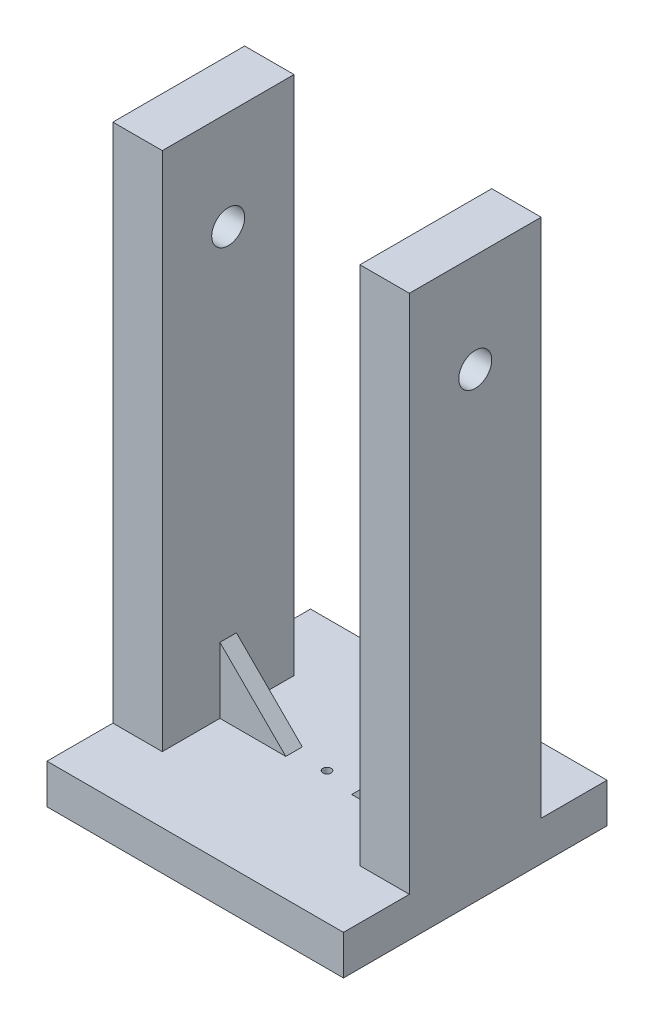
ISO-10303-21;
HEADER;
FILE_DESCRIPTION(('STEP AP214'),'2;1');
FILE_NAME('part.step','',(''),(''),'','','');
FILE_SCHEMA(('AUTOMOTIVE_DESIGN { 1 0 10303 214 1 1 1 1 }'));
ENDSEC;
DATA;
#1=APPLICATION_CONTEXT('core data for automotive mechanical design processes');
#2=APPLICATION_PROTOCOL_DEFINITION('international standard','automotive_design',2000,#1);
#3=PRODUCT_CONTEXT('',#1,'mechanical');
#4=PRODUCT('Part','Part','',(#3));
#5=PRODUCT_RELATED_PRODUCT_CATEGORY('part','',(#4));
#6=PRODUCT_DEFINITION_FORMATION('','',#4);
#7=PRODUCT_DEFINITION_CONTEXT('part definition',#1,'design');
#8=PRODUCT_DEFINITION('design','',#6,#7);
#9=PRODUCT_DEFINITION_SHAPE('','',#8);
#10=(LENGTH_UNIT() NAMED_UNIT(*) SI_UNIT(.MILLI.,.METRE.));
#11=(NAMED_UNIT(*) PLANE_ANGLE_UNIT() SI_UNIT($,.RADIAN.));
#12=(NAMED_UNIT(*) SI_UNIT($,.STERADIAN.) SOLID_ANGLE_UNIT());
#13=UNCERTAINTY_MEASURE_WITH_UNIT(LENGTH_MEASURE(1.E-05),#10,'distance_accuracy_value','');
#14=(GEOMETRIC_REPRESENTATION_CONTEXT(3) GLOBAL_UNCERTAINTY_ASSIGNED_CONTEXT((#13)) GLOBAL_UNIT_ASSIGNED_CONTEXT((#10,
#11,#12)) REPRESENTATION_CONTEXT('',''));
#15=CARTESIAN_POINT('',(0.,0.,0.));
#16=DIRECTION('',(0.,0.,1.));
#17=DIRECTION('',(1.,0.,0.));
#18=AXIS2_PLACEMENT_3D('',#15,#16,#17);
#19=CARTESIAN_POINT('',(0.,12.,0.));
#20=DIRECTION('',(0.,1.,0.));
#21=DIRECTION('',(0.,0.,1.));
#22=AXIS2_PLACEMENT_3D('',#19,#20,#21);
#23=PLANE('',#22);
#24=DIRECTION('',(1.,0.,0.));
#25=VECTOR('',#24,1.);
#26=CARTESIAN_POINT('',(0.,12.,2.5));
#27=LINE('',#26,#25);
#28=CARTESIAN_POINT('',(10.,12.,2.5));
#29=VERTEX_POINT('',#28);
#30=CARTESIAN_POINT('',(30.,12.,2.5));
#31=VERTEX_POINT('',#30);
#32=EDGE_CURVE('E59',#29,#31,#27,.T.);
#33=ORIENTED_EDGE('',*,*,#32,.F.);
#34=DIRECTION('',(0.,0.,1.));
#35=VECTOR('',#34,1.);
#36=CARTESIAN_POINT('',(10.,12.,0.));
#37=LINE('',#36,#35);
#38=CARTESIAN_POINT('',(10.,12.,-2.5));
#39=VERTEX_POINT('',#38);
#40=EDGE_CURVE('E63',#39,#29,#37,.T.);
#41=ORIENTED_EDGE('',*,*,#40,.F.);
#42=DIRECTION('',(1.,0.,0.));
#43=VECTOR('',#42,1.);
#44=CARTESIAN_POINT('',(0.,12.,-2.5));
#45=LINE('',#44,#43);
#46=CARTESIAN_POINT('',(30.,12.,-2.5));
#47=VERTEX_POINT('',#46);
#48=EDGE_CURVE('E180',#39,#47,#45,.T.);
#49=ORIENTED_EDGE('',*,*,#48,.T.);
#50=DIRECTION('',(0.,0.,1.));
#51=VECTOR('',#50,1.);
#52=CARTESIAN_POINT('',(30.,12.,20.));
#53=LINE('',#52,#51);
#54=CARTESIAN_POINT('',(30.,12.,-20.));
#55=VERTEX_POINT('',#54);
#56=EDGE_CURVE('E168',#55,#47,#53,.T.);
#57=ORIENTED_EDGE('',*,*,#56,.F.);
#58=DIRECTION('',(-1.,0.,0.));
#59=VECTOR('',#58,1.);
#60=CARTESIAN_POINT('',(30.,12.,-20.));
#61=LINE('',#60,#59);
#62=CARTESIAN_POINT('',(45.,12.,-20.));
#63=VERTEX_POINT('',#62);
#64=EDGE_CURVE('E177',#63,#55,#61,.T.);
#65=ORIENTED_EDGE('',*,*,#64,.F.);
#66=DIRECTION('',(0.,0.,-1.));
#67=VECTOR('',#66,1.);
#68=CARTESIAN_POINT('',(45.,12.,-40.));
#69=LINE('',#68,#67);
#70=CARTESIAN_POINT('',(45.,12.,-40.));
#71=VERTEX_POINT('',#70);
#72=EDGE_CURVE('E230',#63,#71,#69,.T.);
#73=ORIENTED_EDGE('',*,*,#72,.T.);
#74=DIRECTION('',(-1.,0.,0.));
#75=VECTOR('',#74,1.);
#76=CARTESIAN_POINT('',(-45.,12.,-40.));
#77=LINE('',#76,#75);
#78=CARTESIAN_POINT('',(-45.,12.,-40.));
#79=VERTEX_POINT('',#78);
#80=EDGE_CURVE('E247',#71,#79,#77,.T.);
#81=ORIENTED_EDGE('',*,*,#80,.T.);
#82=DIRECTION('',(0.,0.,1.));
#83=VECTOR('',#82,1.);
#84=CARTESIAN_POINT('',(-45.,12.,-40.));
#85=LINE('',#84,#83);
#86=CARTESIAN_POINT('',(-45.,12.,-20.));
#87=VERTEX_POINT('',#86);
#88=EDGE_CURVE('E243',#79,#87,#85,.T.);
#89=ORIENTED_EDGE('',*,*,#88,.T.);
#90=DIRECTION('',(-1.,0.,0.));
#91=VECTOR('',#90,1.);
#92=CARTESIAN_POINT('',(-45.,12.,-20.));
#93=LINE('',#92,#91);
#94=CARTESIAN_POINT('',(-30.,12.,-20.));
#95=VERTEX_POINT('',#94);
#96=EDGE_CURVE('E275',#95,#87,#93,.T.);
#97=ORIENTED_EDGE('',*,*,#96,.F.);
#98=DIRECTION('',(0.,0.,-1.));
#99=VECTOR('',#98,1.);
#100=CARTESIAN_POINT('',(-30.,12.,20.));
#101=LINE('',#100,#99);
#102=CARTESIAN_POINT('',(-30.,12.,-2.5));
#103=VERTEX_POINT('',#102);
#104=EDGE_CURVE('E283',#103,#95,#101,.T.);
#105=ORIENTED_EDGE('',*,*,#104,.F.);
#106=DIRECTION('',(1.,0.,0.));
#107=VECTOR('',#106,1.);
#108=CARTESIAN_POINT('',(0.,12.,-2.5));
#109=LINE('',#108,#107);
#110=CARTESIAN_POINT('',(-10.,12.,-2.5));
#111=VERTEX_POINT('',#110);
#112=EDGE_CURVE('E342',#103,#111,#109,.T.);
#113=ORIENTED_EDGE('',*,*,#112,.T.);
#114=DIRECTION('',(0.,0.,1.));
#115=VECTOR('',#114,1.);
#116=CARTESIAN_POINT('',(-10.,12.,0.));
#117=LINE('',#116,#115);
#118=CARTESIAN_POINT('',(-10.,12.,2.5));
#119=VERTEX_POINT('',#118);
#120=EDGE_CURVE('E345',#119,#111,#117,.F.);
#121=ORIENTED_EDGE('',*,*,#120,.F.);
#122=DIRECTION('',(1.,0.,0.));
#123=VECTOR('',#122,1.);
#124=CARTESIAN_POINT('',(0.,12.,2.5));
#125=LINE('',#124,#123);
#126=CARTESIAN_POINT('',(-30.,12.,2.5));
#127=VERTEX_POINT('',#126);
#128=EDGE_CURVE('E338',#127,#119,#125,.T.);
#129=ORIENTED_EDGE('',*,*,#128,.F.);
#130=CARTESIAN_POINT('',(-30.,12.,20.));
#131=VERTEX_POINT('',#130);
#132=EDGE_CURVE('E279',#131,#127,#101,.T.);
#133=ORIENTED_EDGE('',*,*,#132,.F.);
#134=DIRECTION('',(1.,0.,0.));
#135=VECTOR('',#134,1.);
#136=CARTESIAN_POINT('',(-45.,12.,20.));
#137=LINE('',#136,#135);
#138=CARTESIAN_POINT('',(-45.,12.,20.));
#139=VERTEX_POINT('',#138);
#140=EDGE_CURVE('E270',#139,#131,#137,.T.);
#141=ORIENTED_EDGE('',*,*,#140,.F.);
#142=CARTESIAN_POINT('',(-45.,12.,40.));
#143=VERTEX_POINT('',#142);
#144=EDGE_CURVE('E246',#139,#143,#85,.T.);
#145=ORIENTED_EDGE('',*,*,#144,.T.);
#146=DIRECTION('',(1.,0.,0.));
#147=VECTOR('',#146,1.);
#148=CARTESIAN_POINT('',(-45.,12.,40.));
#149=LINE('',#148,#147);
#150=CARTESIAN_POINT('',(45.,12.,40.));
#151=VERTEX_POINT('',#150);
#152=EDGE_CURVE('E226',#143,#151,#149,.T.);
#153=ORIENTED_EDGE('',*,*,#152,.T.);
#154=CARTESIAN_POINT('',(45.,12.,20.));
#155=VERTEX_POINT('',#154);
#156=EDGE_CURVE('E250',#151,#155,#69,.T.);
#157=ORIENTED_EDGE('',*,*,#156,.T.);
#158=DIRECTION('',(1.,0.,0.));
#159=VECTOR('',#158,1.);
#160=CARTESIAN_POINT('',(30.,12.,20.));
#161=LINE('',#160,#159);
#162=CARTESIAN_POINT('',(30.,12.,20.));
#163=VERTEX_POINT('',#162);
#164=EDGE_CURVE('E299',#163,#155,#161,.T.);
#165=ORIENTED_EDGE('',*,*,#164,.F.);
#166=EDGE_CURVE('E178',#31,#163,#53,.T.);
#167=ORIENTED_EDGE('',*,*,#166,.F.);
#168=EDGE_LOOP('',(#33,#41,#49,#57,#65,#73,#81,#89,#97,#105,#113,#121,#129,#133,#141,#145,#153,
#157,#165,#167));
#169=FACE_BOUND('',#168,.T.);
#170=CARTESIAN_POINT('',(0.,12.,0.));
#171=DIRECTION('',(0.,1.,0.));
#172=DIRECTION('',(0.,0.,1.));
#173=AXIS2_PLACEMENT_3D('',#170,#171,#172);
#174=CIRCLE('',#173,1.25);
#175=CARTESIAN_POINT('',(0.,12.,1.25));
#176=VERTEX_POINT('',#175);
#177=EDGE_CURVE('E199',#176,#176,#174,.F.);
#178=ORIENTED_EDGE('',*,*,#177,.T.);
#179=EDGE_LOOP('',(#178));
#180=FACE_BOUND('',#179,.T.);
#181=ADVANCED_FACE('F43',(#169,#180),#23,.T.);
#182=CARTESIAN_POINT('',(45.,12.,-40.));
#183=DIRECTION('',(-1.,0.,0.));
#184=DIRECTION('',(0.,0.,1.));
#185=AXIS2_PLACEMENT_3D('',#182,#183,#184);
#186=PLANE('',#185);
#187=CARTESIAN_POINT('',(45.,140.,0.));
#188=DIRECTION('',(1.,0.,0.));
#189=DIRECTION('',(0.,0.,-1.));
#190=AXIS2_PLACEMENT_3D('',#187,#188,#189);
#191=CIRCLE('',#190,5.);
#192=CARTESIAN_POINT('',(45.,140.,-5.));
#193=VERTEX_POINT('',#192);
#194=EDGE_CURVE('E203',#193,#193,#191,.T.);
#195=ORIENTED_EDGE('',*,*,#194,.F.);
#196=EDGE_LOOP('',(#195));
#197=FACE_BOUND('',#196,.T.);
#198=DIRECTION('',(0.,0.,-1.));
#199=VECTOR('',#198,1.);
#200=CARTESIAN_POINT('',(45.,0.,-40.));
#201=LINE('',#200,#199);
#202=CARTESIAN_POINT('',(45.,0.,40.));
#203=VERTEX_POINT('',#202);
#204=CARTESIAN_POINT('',(45.,0.,-40.));
#205=VERTEX_POINT('',#204);
#206=EDGE_CURVE('E237',#203,#205,#201,.T.);
#207=ORIENTED_EDGE('',*,*,#206,.T.);
#208=DIRECTION('',(0.,-1.,0.));
#209=VECTOR('',#208,1.);
#210=CARTESIAN_POINT('',(45.,12.,-40.));
#211=LINE('',#210,#209);
#212=EDGE_CURVE('E198',#71,#205,#211,.T.);
#213=ORIENTED_EDGE('',*,*,#212,.F.);
#214=ORIENTED_EDGE('',*,*,#72,.F.);
#215=DIRECTION('',(0.,-1.,0.));
#216=VECTOR('',#215,1.);
#217=CARTESIAN_POINT('',(45.,170.,-20.));
#218=LINE('',#217,#216);
#219=CARTESIAN_POINT('',(45.,170.,-20.));
#220=VERTEX_POINT('',#219);
#221=EDGE_CURVE('E323',#220,#63,#218,.T.);
#222=ORIENTED_EDGE('',*,*,#221,.F.);
#223=DIRECTION('',(0.,0.,-1.));
#224=VECTOR('',#223,1.);
#225=CARTESIAN_POINT('',(45.,170.,20.));
#226=LINE('',#225,#224);
#227=CARTESIAN_POINT('',(45.,170.,20.));
#228=VERTEX_POINT('',#227);
#229=EDGE_CURVE('E295',#228,#220,#226,.T.);
#230=ORIENTED_EDGE('',*,*,#229,.F.);
#231=DIRECTION('',(0.,-1.,0.));
#232=VECTOR('',#231,1.);
#233=CARTESIAN_POINT('',(45.,170.,20.));
#234=LINE('',#233,#232);
#235=EDGE_CURVE('E309',#228,#155,#234,.T.);
#236=ORIENTED_EDGE('',*,*,#235,.T.);
#237=ORIENTED_EDGE('',*,*,#156,.F.);
#238=DIRECTION('',(0.,-1.,0.));
#239=VECTOR('',#238,1.);
#240=CARTESIAN_POINT('',(45.,12.,40.));
#241=LINE('',#240,#239);
#242=EDGE_CURVE('E222',#151,#203,#241,.T.);
#243=ORIENTED_EDGE('',*,*,#242,.T.);
#244=EDGE_LOOP('',(#207,#213,#214,#222,#230,#236,#237,#243));
#245=FACE_BOUND('',#244,.T.);
#246=ADVANCED_FACE('F45',(#197,#245),#186,.F.);
#247=CARTESIAN_POINT('',(-45.,12.,-40.));
#248=DIRECTION('',(0.,0.,1.));
#249=DIRECTION('',(1.,0.,0.));
#250=AXIS2_PLACEMENT_3D('',#247,#248,#249);
#251=PLANE('',#250);
#252=DIRECTION('',(-1.,0.,0.));
#253=VECTOR('',#252,1.);
#254=CARTESIAN_POINT('',(-45.,0.,-40.));
#255=LINE('',#254,#253);
#256=CARTESIAN_POINT('',(-45.,0.,-40.));
#257=VERTEX_POINT('',#256);
#258=EDGE_CURVE('E234',#205,#257,#255,.T.);
#259=ORIENTED_EDGE('',*,*,#258,.T.);
#260=DIRECTION('',(0.,-1.,0.));
#261=VECTOR('',#260,1.);
#262=CARTESIAN_POINT('',(-45.,12.,-40.));
#263=LINE('',#262,#261);
#264=EDGE_CURVE('E214',#79,#257,#263,.T.);
#265=ORIENTED_EDGE('',*,*,#264,.F.);
#266=ORIENTED_EDGE('',*,*,#80,.F.);
#267=ORIENTED_EDGE('',*,*,#212,.T.);
#268=EDGE_LOOP('',(#259,#265,#266,#267));
#269=FACE_BOUND('',#268,.T.);
#270=ADVANCED_FACE('F414',(#269),#251,.F.);
#271=CARTESIAN_POINT('',(-45.,12.,-40.));
#272=DIRECTION('',(1.,0.,0.));
#273=DIRECTION('',(0.,0.,-1.));
#274=AXIS2_PLACEMENT_3D('',#271,#272,#273);
#275=PLANE('',#274);
#276=DIRECTION('',(0.,0.,1.));
#277=VECTOR('',#276,1.);
#278=CARTESIAN_POINT('',(-45.,0.,-40.));
#279=LINE('',#278,#277);
#280=CARTESIAN_POINT('',(-45.,0.,40.));
#281=VERTEX_POINT('',#280);
#282=EDGE_CURVE('E231',#257,#281,#279,.T.);
#283=ORIENTED_EDGE('',*,*,#282,.T.);
#284=DIRECTION('',(0.,-1.,0.));
#285=VECTOR('',#284,1.);
#286=CARTESIAN_POINT('',(-45.,12.,40.));
#287=LINE('',#286,#285);
#288=EDGE_CURVE('E218',#143,#281,#287,.T.);
#289=ORIENTED_EDGE('',*,*,#288,.F.);
#290=ORIENTED_EDGE('',*,*,#144,.F.);
#291=DIRECTION('',(0.,-1.,0.));
#292=VECTOR('',#291,1.);
#293=CARTESIAN_POINT('',(-45.,170.,20.));
#294=LINE('',#293,#292);
#295=CARTESIAN_POINT('',(-45.,170.,20.));
#296=VERTEX_POINT('',#295);
#297=EDGE_CURVE('E261',#296,#139,#294,.T.);
#298=ORIENTED_EDGE('',*,*,#297,.F.);
#299=DIRECTION('',(0.,0.,1.));
#300=VECTOR('',#299,1.);
#301=CARTESIAN_POINT('',(-45.,170.,20.));
#302=LINE('',#301,#300);
#303=CARTESIAN_POINT('',(-45.,170.,-20.));
#304=VERTEX_POINT('',#303);
#305=EDGE_CURVE('E286',#304,#296,#302,.T.);
#306=ORIENTED_EDGE('',*,*,#305,.F.);
#307=DIRECTION('',(0.,-1.,0.));
#308=VECTOR('',#307,1.);
#309=CARTESIAN_POINT('',(-45.,170.,-20.));
#310=LINE('',#309,#308);
#311=EDGE_CURVE('E257',#304,#87,#310,.T.);
#312=ORIENTED_EDGE('',*,*,#311,.T.);
#313=ORIENTED_EDGE('',*,*,#88,.F.);
#314=ORIENTED_EDGE('',*,*,#264,.T.);
#315=EDGE_LOOP('',(#283,#289,#290,#298,#306,#312,#313,#314));
#316=FACE_BOUND('',#315,.T.);
#317=CARTESIAN_POINT('',(-45.,140.,0.));
#318=DIRECTION('',(1.,0.,0.));
#319=DIRECTION('',(0.,0.,-1.));
#320=AXIS2_PLACEMENT_3D('',#317,#318,#319);
#321=CIRCLE('',#320,5.);
#322=CARTESIAN_POINT('',(-45.,140.,-5.));
#323=VERTEX_POINT('',#322);
#324=EDGE_CURVE('E210',#323,#323,#321,.T.);
#325=ORIENTED_EDGE('',*,*,#324,.T.);
#326=EDGE_LOOP('',(#325));
#327=FACE_BOUND('',#326,.T.);
#328=ADVANCED_FACE('F390',(#316,#327),#275,.F.);
#329=CARTESIAN_POINT('',(-45.,12.,40.));
#330=DIRECTION('',(0.,0.,-1.));
#331=DIRECTION('',(-1.,0.,0.));
#332=AXIS2_PLACEMENT_3D('',#329,#330,#331);
#333=PLANE('',#332);
#334=DIRECTION('',(1.,0.,0.));
#335=VECTOR('',#334,1.);
#336=CARTESIAN_POINT('',(-45.,0.,40.));
#337=LINE('',#336,#335);
#338=EDGE_CURVE('E227',#281,#203,#337,.T.);
#339=ORIENTED_EDGE('',*,*,#338,.T.);
#340=ORIENTED_EDGE('',*,*,#242,.F.);
#341=ORIENTED_EDGE('',*,*,#152,.F.);
#342=ORIENTED_EDGE('',*,*,#288,.T.);
#343=EDGE_LOOP('',(#339,#340,#341,#342));
#344=FACE_BOUND('',#343,.T.);
#345=ADVANCED_FACE('F395',(#344),#333,.F.);
#346=CARTESIAN_POINT('',(0.,0.,0.));
#347=DIRECTION('',(0.,1.,0.));
#348=DIRECTION('',(0.,0.,1.));
#349=AXIS2_PLACEMENT_3D('',#346,#347,#348);
#350=PLANE('',#349);
#351=ORIENTED_EDGE('',*,*,#258,.F.);
#352=ORIENTED_EDGE('',*,*,#206,.F.);
#353=ORIENTED_EDGE('',*,*,#338,.F.);
#354=ORIENTED_EDGE('',*,*,#282,.F.);
#355=EDGE_LOOP('',(#351,#352,#353,#354));
#356=FACE_BOUND('',#355,.T.);
#357=ADVANCED_FACE('F461',(#356),#350,.F.);
#358=CARTESIAN_POINT('',(-30.,170.,20.));
#359=DIRECTION('',(-1.,0.,0.));
#360=DIRECTION('',(0.,0.,1.));
#361=AXIS2_PLACEMENT_3D('',#358,#359,#360);
#362=PLANE('',#361);
#363=CARTESIAN_POINT('',(-30.,140.,0.));
#364=DIRECTION('',(-1.,0.,0.));
#365=DIRECTION('',(0.,0.,1.));
#366=AXIS2_PLACEMENT_3D('',#363,#364,#365);
#367=CIRCLE('',#366,5.);
#368=CARTESIAN_POINT('',(-30.,140.,5.));
#369=VERTEX_POINT('',#368);
#370=EDGE_CURVE('E209',#369,#369,#367,.T.);
#371=ORIENTED_EDGE('',*,*,#370,.T.);
#372=EDGE_LOOP('',(#371));
#373=FACE_BOUND('',#372,.T.);
#374=ORIENTED_EDGE('',*,*,#132,.T.);
#375=DIRECTION('',(0.,1.,0.));
#376=VECTOR('',#375,1.);
#377=CARTESIAN_POINT('',(-30.,170.,2.5));
#378=LINE('',#377,#376);
#379=CARTESIAN_POINT('',(-30.,32.,2.5));
#380=VERTEX_POINT('',#379);
#381=EDGE_CURVE('E190',#127,#380,#378,.T.);
#382=ORIENTED_EDGE('',*,*,#381,.T.);
#383=DIRECTION('',(0.,0.,1.));
#384=VECTOR('',#383,1.);
#385=CARTESIAN_POINT('',(-30.,32.,20.));
#386=LINE('',#385,#384);
#387=CARTESIAN_POINT('',(-30.,32.,-2.5));
#388=VERTEX_POINT('',#387);
#389=EDGE_CURVE('E349',#380,#388,#386,.F.);
#390=ORIENTED_EDGE('',*,*,#389,.T.);
#391=DIRECTION('',(0.,1.,0.));
#392=VECTOR('',#391,1.);
#393=CARTESIAN_POINT('',(-30.,170.,-2.5));
#394=LINE('',#393,#392);
#395=EDGE_CURVE('E192',#103,#388,#394,.T.);
#396=ORIENTED_EDGE('',*,*,#395,.F.);
#397=ORIENTED_EDGE('',*,*,#104,.T.);
#398=DIRECTION('',(0.,-1.,0.));
#399=VECTOR('',#398,1.);
#400=CARTESIAN_POINT('',(-30.,170.,-20.));
#401=LINE('',#400,#399);
#402=CARTESIAN_POINT('',(-30.,170.,-20.));
#403=VERTEX_POINT('',#402);
#404=EDGE_CURVE('E240',#403,#95,#401,.T.);
#405=ORIENTED_EDGE('',*,*,#404,.F.);
#406=DIRECTION('',(0.,0.,-1.));
#407=VECTOR('',#406,1.);
#408=CARTESIAN_POINT('',(-30.,170.,20.));
#409=LINE('',#408,#407);
#410=CARTESIAN_POINT('',(-30.,170.,20.));
#411=VERTEX_POINT('',#410);
#412=EDGE_CURVE('E274',#411,#403,#409,.T.);
#413=ORIENTED_EDGE('',*,*,#412,.F.);
#414=DIRECTION('',(0.,-1.,0.));
#415=VECTOR('',#414,1.);
#416=CARTESIAN_POINT('',(-30.,170.,20.));
#417=LINE('',#416,#415);
#418=EDGE_CURVE('E265',#411,#131,#417,.T.);
#419=ORIENTED_EDGE('',*,*,#418,.T.);
#420=EDGE_LOOP('',(#374,#382,#390,#396,#397,#405,#413,#419));
#421=FACE_BOUND('',#420,.T.);
#422=ADVANCED_FACE('F430',(#373,#421),#362,.F.);
#423=CARTESIAN_POINT('',(-45.,170.,-20.));
#424=DIRECTION('',(0.,0.,1.));
#425=DIRECTION('',(1.,0.,0.));
#426=AXIS2_PLACEMENT_3D('',#423,#424,#425);
#427=PLANE('',#426);
#428=ORIENTED_EDGE('',*,*,#96,.T.);
#429=ORIENTED_EDGE('',*,*,#311,.F.);
#430=DIRECTION('',(-1.,0.,0.));
#431=VECTOR('',#430,1.);
#432=CARTESIAN_POINT('',(-45.,170.,-20.));
#433=LINE('',#432,#431);
#434=EDGE_CURVE('E289',#403,#304,#433,.T.);
#435=ORIENTED_EDGE('',*,*,#434,.F.);
#436=ORIENTED_EDGE('',*,*,#404,.T.);
#437=EDGE_LOOP('',(#428,#429,#435,#436));
#438=FACE_BOUND('',#437,.T.);
#439=ADVANCED_FACE('F421',(#438),#427,.F.);
#440=CARTESIAN_POINT('',(-45.,170.,20.));
#441=DIRECTION('',(0.,0.,-1.));
#442=DIRECTION('',(-1.,0.,0.));
#443=AXIS2_PLACEMENT_3D('',#440,#441,#442);
#444=PLANE('',#443);
#445=ORIENTED_EDGE('',*,*,#140,.T.);
#446=ORIENTED_EDGE('',*,*,#418,.F.);
#447=DIRECTION('',(1.,0.,0.));
#448=VECTOR('',#447,1.);
#449=CARTESIAN_POINT('',(-45.,170.,20.));
#450=LINE('',#449,#448);
#451=EDGE_CURVE('E269',#296,#411,#450,.T.);
#452=ORIENTED_EDGE('',*,*,#451,.F.);
#453=ORIENTED_EDGE('',*,*,#297,.T.);
#454=EDGE_LOOP('',(#445,#446,#452,#453));
#455=FACE_BOUND('',#454,.T.);
#456=ADVANCED_FACE('F443',(#455),#444,.F.);
#457=CARTESIAN_POINT('',(0.,170.,0.));
#458=DIRECTION('',(0.,-1.,0.));
#459=DIRECTION('',(0.,0.,-1.));
#460=AXIS2_PLACEMENT_3D('',#457,#458,#459);
#461=PLANE('',#460);
#462=ORIENTED_EDGE('',*,*,#412,.T.);
#463=ORIENTED_EDGE('',*,*,#434,.T.);
#464=ORIENTED_EDGE('',*,*,#305,.T.);
#465=ORIENTED_EDGE('',*,*,#451,.T.);
#466=EDGE_LOOP('',(#462,#463,#464,#465));
#467=FACE_BOUND('',#466,.T.);
#468=ADVANCED_FACE('F426',(#467),#461,.F.);
#469=CARTESIAN_POINT('',(30.,170.,-20.));
#470=DIRECTION('',(0.,0.,1.));
#471=DIRECTION('',(1.,0.,0.));
#472=AXIS2_PLACEMENT_3D('',#469,#470,#471);
#473=PLANE('',#472);
#474=ORIENTED_EDGE('',*,*,#64,.T.);
#475=DIRECTION('',(0.,-1.,0.));
#476=VECTOR('',#475,1.);
#477=CARTESIAN_POINT('',(30.,170.,-20.));
#478=LINE('',#477,#476);
#479=CARTESIAN_POINT('',(30.,170.,-20.));
#480=VERTEX_POINT('',#479);
#481=EDGE_CURVE('E174',#480,#55,#478,.T.);
#482=ORIENTED_EDGE('',*,*,#481,.F.);
#483=DIRECTION('',(-1.,0.,0.));
#484=VECTOR('',#483,1.);
#485=CARTESIAN_POINT('',(30.,170.,-20.));
#486=LINE('',#485,#484);
#487=EDGE_CURVE('E300',#220,#480,#486,.T.);
#488=ORIENTED_EDGE('',*,*,#487,.F.);
#489=ORIENTED_EDGE('',*,*,#221,.T.);
#490=EDGE_LOOP('',(#474,#482,#488,#489));
#491=FACE_BOUND('',#490,.T.);
#492=ADVANCED_FACE('F408',(#491),#473,.F.);
#493=CARTESIAN_POINT('',(30.,170.,20.));
#494=DIRECTION('',(1.,0.,0.));
#495=DIRECTION('',(0.,0.,-1.));
#496=AXIS2_PLACEMENT_3D('',#493,#494,#495);
#497=PLANE('',#496);
#498=CARTESIAN_POINT('',(30.,140.,0.));
#499=DIRECTION('',(1.,0.,0.));
#500=DIRECTION('',(0.,0.,-1.));
#501=AXIS2_PLACEMENT_3D('',#498,#499,#500);
#502=CIRCLE('',#501,5.);
#503=CARTESIAN_POINT('',(30.,140.,-5.));
#504=VERTEX_POINT('',#503);
#505=EDGE_CURVE('E205',#504,#504,#502,.T.);
#506=ORIENTED_EDGE('',*,*,#505,.T.);
#507=EDGE_LOOP('',(#506));
#508=FACE_BOUND('',#507,.T.);
#509=DIRECTION('',(0.,0.,1.));
#510=VECTOR('',#509,1.);
#511=CARTESIAN_POINT('',(30.,32.,20.));
#512=LINE('',#511,#510);
#513=CARTESIAN_POINT('',(30.,32.,-2.5));
#514=VERTEX_POINT('',#513);
#515=CARTESIAN_POINT('',(30.,32.,2.5));
#516=VERTEX_POINT('',#515);
#517=EDGE_CURVE('E364',#514,#516,#512,.T.);
#518=ORIENTED_EDGE('',*,*,#517,.T.);
#519=DIRECTION('',(0.,-1.,0.));
#520=VECTOR('',#519,1.);
#521=CARTESIAN_POINT('',(30.,170.,2.5));
#522=LINE('',#521,#520);
#523=EDGE_CURVE('E11',#516,#31,#522,.T.);
#524=ORIENTED_EDGE('',*,*,#523,.T.);
#525=ORIENTED_EDGE('',*,*,#166,.T.);
#526=DIRECTION('',(0.,-1.,0.));
#527=VECTOR('',#526,1.);
#528=CARTESIAN_POINT('',(30.,170.,20.));
#529=LINE('',#528,#527);
#530=CARTESIAN_POINT('',(30.,170.,20.));
#531=VERTEX_POINT('',#530);
#532=EDGE_CURVE('E317',#531,#163,#529,.T.);
#533=ORIENTED_EDGE('',*,*,#532,.F.);
#534=DIRECTION('',(0.,0.,1.));
#535=VECTOR('',#534,1.);
#536=CARTESIAN_POINT('',(30.,170.,20.));
#537=LINE('',#536,#535);
#538=EDGE_CURVE('E303',#480,#531,#537,.T.);
#539=ORIENTED_EDGE('',*,*,#538,.F.);
#540=ORIENTED_EDGE('',*,*,#481,.T.);
#541=ORIENTED_EDGE('',*,*,#56,.T.);
#542=DIRECTION('',(0.,-1.,0.));
#543=VECTOR('',#542,1.);
#544=CARTESIAN_POINT('',(30.,170.,-2.5));
#545=LINE('',#544,#543);
#546=EDGE_CURVE('E52',#514,#47,#545,.T.);
#547=ORIENTED_EDGE('',*,*,#546,.F.);
#548=EDGE_LOOP('',(#518,#524,#525,#533,#539,#540,#541,#547));
#549=FACE_BOUND('',#548,.T.);
#550=ADVANCED_FACE('F169',(#508,#549),#497,.F.);
#551=CARTESIAN_POINT('',(30.,170.,20.));
#552=DIRECTION('',(0.,0.,-1.));
#553=DIRECTION('',(-1.,0.,0.));
#554=AXIS2_PLACEMENT_3D('',#551,#552,#553);
#555=PLANE('',#554);
#556=ORIENTED_EDGE('',*,*,#164,.T.);
#557=ORIENTED_EDGE('',*,*,#235,.F.);
#558=DIRECTION('',(1.,0.,0.));
#559=VECTOR('',#558,1.);
#560=CARTESIAN_POINT('',(30.,170.,20.));
#561=LINE('',#560,#559);
#562=EDGE_CURVE('E306',#531,#228,#561,.T.);
#563=ORIENTED_EDGE('',*,*,#562,.F.);
#564=ORIENTED_EDGE('',*,*,#532,.T.);
#565=EDGE_LOOP('',(#556,#557,#563,#564));
#566=FACE_BOUND('',#565,.T.);
#567=ADVANCED_FACE('F404',(#566),#555,.F.);
#568=CARTESIAN_POINT('',(0.,170.,0.));
#569=DIRECTION('',(0.,-1.,0.));
#570=DIRECTION('',(0.,0.,-1.));
#571=AXIS2_PLACEMENT_3D('',#568,#569,#570);
#572=PLANE('',#571);
#573=ORIENTED_EDGE('',*,*,#229,.T.);
#574=ORIENTED_EDGE('',*,*,#487,.T.);
#575=ORIENTED_EDGE('',*,*,#538,.T.);
#576=ORIENTED_EDGE('',*,*,#562,.T.);
#577=EDGE_LOOP('',(#573,#574,#575,#576));
#578=FACE_BOUND('',#577,.T.);
#579=ADVANCED_FACE('F406',(#578),#572,.F.);
#580=CARTESIAN_POINT('',(-45.,140.,0.));
#581=DIRECTION('',(1.,0.,0.));
#582=DIRECTION('',(0.,0.,-1.));
#583=AXIS2_PLACEMENT_3D('',#580,#581,#582);
#584=CYLINDRICAL_SURFACE('',#583,5.);
#585=ORIENTED_EDGE('',*,*,#194,.T.);
#586=EDGE_LOOP('',(#585));
#587=FACE_BOUND('',#586,.T.);
#588=ORIENTED_EDGE('',*,*,#505,.F.);
#589=EDGE_LOOP('',(#588));
#590=FACE_BOUND('',#589,.T.);
#591=ADVANCED_FACE('F559',(#587,#590),#584,.F.);
#592=ORIENTED_EDGE('',*,*,#324,.F.);
#593=EDGE_LOOP('',(#592));
#594=FACE_BOUND('',#593,.T.);
#595=ORIENTED_EDGE('',*,*,#370,.F.);
#596=EDGE_LOOP('',(#595));
#597=FACE_BOUND('',#596,.T.);
#598=ADVANCED_FACE('F568',(#594,#597),#584,.F.);
#599=CARTESIAN_POINT('',(0.,170.,0.));
#600=DIRECTION('',(0.,-1.,0.));
#601=DIRECTION('',(0.,0.,-1.));
#602=AXIS2_PLACEMENT_3D('',#599,#600,#601);
#603=CYLINDRICAL_SURFACE('',#602,1.25);
#604=CARTESIAN_POINT('',(0.,2.,0.));
#605=DIRECTION('',(0.,1.,0.));
#606=DIRECTION('',(0.,0.,1.));
#607=AXIS2_PLACEMENT_3D('',#604,#605,#606);
#608=CIRCLE('',#607,1.25);
#609=CARTESIAN_POINT('',(0.,2.,1.25));
#610=VERTEX_POINT('',#609);
#611=EDGE_CURVE('E204',#610,#610,#608,.T.);
#612=ORIENTED_EDGE('',*,*,#611,.F.);
#613=EDGE_LOOP('',(#612));
#614=FACE_BOUND('',#613,.T.);
#615=ORIENTED_EDGE('',*,*,#177,.F.);
#616=EDGE_LOOP('',(#615));
#617=FACE_BOUND('',#616,.T.);
#618=ADVANCED_FACE('F578',(#614,#617),#603,.F.);
#619=CARTESIAN_POINT('',(0.,2.,0.));
#620=DIRECTION('',(0.,1.,0.));
#621=DIRECTION('',(0.,0.,1.));
#622=AXIS2_PLACEMENT_3D('',#619,#620,#621);
#623=PLANE('',#622);
#624=ORIENTED_EDGE('',*,*,#611,.T.);
#625=EDGE_LOOP('',(#624));
#626=FACE_BOUND('',#625,.T.);
#627=ADVANCED_FACE('F589',(#626),#623,.T.);
#628=CARTESIAN_POINT('',(-30.,32.,0.));
#629=DIRECTION('',(-0.707106781186548,-0.707106781186548,0.));
#630=DIRECTION('',(0.707106781186548,-0.707106781186548,0.));
#631=AXIS2_PLACEMENT_3D('',#628,#629,#630);
#632=PLANE('',#631);
#633=DIRECTION('',(0.707106781186548,-0.707106781186548,0.));
#634=VECTOR('',#633,1.);
#635=CARTESIAN_POINT('',(-30.,32.,2.5));
#636=LINE('',#635,#634);
#637=EDGE_CURVE('E352',#380,#119,#636,.T.);
#638=ORIENTED_EDGE('',*,*,#637,.T.);
#639=ORIENTED_EDGE('',*,*,#120,.T.);
#640=DIRECTION('',(0.707106781186548,-0.707106781186548,0.));
#641=VECTOR('',#640,1.);
#642=CARTESIAN_POINT('',(-30.,32.,-2.5));
#643=LINE('',#642,#641);
#644=EDGE_CURVE('E353',#388,#111,#643,.T.);
#645=ORIENTED_EDGE('',*,*,#644,.F.);
#646=ORIENTED_EDGE('',*,*,#389,.F.);
#647=EDGE_LOOP('',(#638,#639,#645,#646));
#648=FACE_BOUND('',#647,.T.);
#649=ADVANCED_FACE('F437',(#648),#632,.F.);
#650=CARTESIAN_POINT('',(0.,85.,2.5));
#651=DIRECTION('',(0.,0.,1.));
#652=DIRECTION('',(1.,0.,0.));
#653=AXIS2_PLACEMENT_3D('',#650,#651,#652);
#654=PLANE('',#653);
#655=ORIENTED_EDGE('',*,*,#381,.F.);
#656=ORIENTED_EDGE('',*,*,#128,.T.);
#657=ORIENTED_EDGE('',*,*,#637,.F.);
#658=EDGE_LOOP('',(#655,#656,#657));
#659=FACE_BOUND('',#658,.T.);
#660=ADVANCED_FACE('F441',(#659),#654,.T.);
#661=CARTESIAN_POINT('',(0.,85.,-2.5));
#662=DIRECTION('',(0.,0.,1.));
#663=DIRECTION('',(1.,0.,0.));
#664=AXIS2_PLACEMENT_3D('',#661,#662,#663);
#665=PLANE('',#664);
#666=ORIENTED_EDGE('',*,*,#112,.F.);
#667=ORIENTED_EDGE('',*,*,#395,.T.);
#668=ORIENTED_EDGE('',*,*,#644,.T.);
#669=EDGE_LOOP('',(#666,#667,#668));
#670=FACE_BOUND('',#669,.T.);
#671=ADVANCED_FACE('F433',(#670),#665,.F.);
#672=CARTESIAN_POINT('',(30.,32.,0.));
#673=DIRECTION('',(-0.707106781186548,0.707106781186548,0.));
#674=DIRECTION('',(-0.707106781186548,-0.707106781186548,0.));
#675=AXIS2_PLACEMENT_3D('',#672,#673,#674);
#676=PLANE('',#675);
#677=DIRECTION('',(-0.707106781186548,-0.707106781186548,0.));
#678=VECTOR('',#677,1.);
#679=CARTESIAN_POINT('',(30.,32.,-2.5));
#680=LINE('',#679,#678);
#681=EDGE_CURVE('E188',#514,#39,#680,.T.);
#682=ORIENTED_EDGE('',*,*,#681,.T.);
#683=ORIENTED_EDGE('',*,*,#40,.T.);
#684=DIRECTION('',(-0.707106781186548,-0.707106781186548,0.));
#685=VECTOR('',#684,1.);
#686=CARTESIAN_POINT('',(30.,32.,2.5));
#687=LINE('',#686,#685);
#688=EDGE_CURVE('E367',#516,#29,#687,.T.);
#689=ORIENTED_EDGE('',*,*,#688,.F.);
#690=ORIENTED_EDGE('',*,*,#517,.F.);
#691=EDGE_LOOP('',(#682,#683,#689,#690));
#692=FACE_BOUND('',#691,.T.);
#693=ADVANCED_FACE('F377',(#692),#676,.T.);
#694=CARTESIAN_POINT('',(0.,85.,2.5));
#695=DIRECTION('',(0.,0.,1.));
#696=DIRECTION('',(1.,0.,0.));
#697=AXIS2_PLACEMENT_3D('',#694,#695,#696);
#698=PLANE('',#697);
#699=ORIENTED_EDGE('',*,*,#688,.T.);
#700=ORIENTED_EDGE('',*,*,#32,.T.);
#701=ORIENTED_EDGE('',*,*,#523,.F.);
#702=EDGE_LOOP('',(#699,#700,#701));
#703=FACE_BOUND('',#702,.T.);
#704=ADVANCED_FACE('F375',(#703),#698,.T.);
#705=CARTESIAN_POINT('',(0.,85.,-2.5));
#706=DIRECTION('',(0.,0.,1.));
#707=DIRECTION('',(1.,0.,0.));
#708=AXIS2_PLACEMENT_3D('',#705,#706,#707);
#709=PLANE('',#708);
#710=ORIENTED_EDGE('',*,*,#48,.F.);
#711=ORIENTED_EDGE('',*,*,#681,.F.);
#712=ORIENTED_EDGE('',*,*,#546,.T.);
#713=EDGE_LOOP('',(#710,#711,#712));
#714=FACE_BOUND('',#713,.T.);
#715=ADVANCED_FACE('F187',(#714),#709,.F.);
#716=CLOSED_SHELL('',(#181,#246,#270,#328,#345,#357,#422,#439,#456,#468,#492,#550,#567,#579,
#591,#598,#618,#627,#649,#660,#671,#693,#704,#715));
#717=MANIFOLD_SOLID_BREP('B2',#716);
#718=ADVANCED_BREP_SHAPE_REPRESENTATION('',(#18,#717),#14);
#719=SHAPE_DEFINITION_REPRESENTATION(#9,#718);
ENDSEC;
END-ISO-10303-21;
